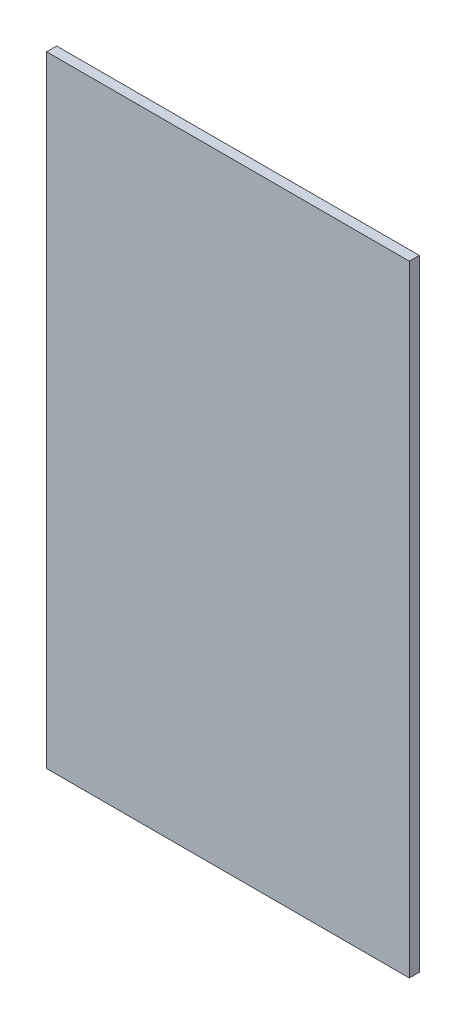
ISO-10303-21;
HEADER;
FILE_DESCRIPTION(('STEP AP214'),'2;1');
FILE_NAME('part.step','',(''),(''),'','','');
FILE_SCHEMA(('AUTOMOTIVE_DESIGN { 1 0 10303 214 1 1 1 1 }'));
ENDSEC;
DATA;
#1=APPLICATION_CONTEXT('core data for automotive mechanical design processes');
#2=APPLICATION_PROTOCOL_DEFINITION('international standard','automotive_design',2000,#1);
#3=PRODUCT_CONTEXT('',#1,'mechanical');
#4=PRODUCT('Part','Part','',(#3));
#5=PRODUCT_RELATED_PRODUCT_CATEGORY('part','',(#4));
#6=PRODUCT_DEFINITION_FORMATION('','',#4);
#7=PRODUCT_DEFINITION_CONTEXT('part definition',#1,'design');
#8=PRODUCT_DEFINITION('design','',#6,#7);
#9=PRODUCT_DEFINITION_SHAPE('','',#8);
#10=(LENGTH_UNIT() NAMED_UNIT(*) SI_UNIT(.MILLI.,.METRE.));
#11=(NAMED_UNIT(*) PLANE_ANGLE_UNIT() SI_UNIT($,.RADIAN.));
#12=(NAMED_UNIT(*) SI_UNIT($,.STERADIAN.) SOLID_ANGLE_UNIT());
#13=UNCERTAINTY_MEASURE_WITH_UNIT(LENGTH_MEASURE(1.E-05),#10,'distance_accuracy_value','');
#14=(GEOMETRIC_REPRESENTATION_CONTEXT(3) GLOBAL_UNCERTAINTY_ASSIGNED_CONTEXT((#13)) GLOBAL_UNIT_ASSIGNED_CONTEXT((#10,
#11,#12)) REPRESENTATION_CONTEXT('',''));
#15=CARTESIAN_POINT('',(0.,0.,0.));
#16=DIRECTION('',(0.,0.,1.));
#17=DIRECTION('',(1.,0.,0.));
#18=AXIS2_PLACEMENT_3D('',#15,#16,#17);
#19=CARTESIAN_POINT('',(0.,0.,12.7));
#20=DIRECTION('',(1.,0.,0.));
#21=DIRECTION('',(0.,0.,-1.));
#22=AXIS2_PLACEMENT_3D('',#19,#20,#21);
#23=PLANE('',#22);
#24=DIRECTION('',(0.,-1.,0.));
#25=VECTOR('',#24,1.);
#26=CARTESIAN_POINT('',(0.,0.,0.));
#27=LINE('',#26,#25);
#28=CARTESIAN_POINT('',(0.,787.4,0.));
#29=VERTEX_POINT('',#28);
#30=CARTESIAN_POINT('',(0.,0.,0.));
#31=VERTEX_POINT('',#30);
#32=EDGE_CURVE('E97',#29,#31,#27,.T.);
#33=ORIENTED_EDGE('',*,*,#32,.T.);
#34=DIRECTION('',(0.,0.,-1.));
#35=VECTOR('',#34,1.);
#36=CARTESIAN_POINT('',(0.,0.,12.7));
#37=LINE('',#36,#35);
#38=CARTESIAN_POINT('',(0.,0.,12.7));
#39=VERTEX_POINT('',#38);
#40=EDGE_CURVE('E11',#39,#31,#37,.T.);
#41=ORIENTED_EDGE('',*,*,#40,.F.);
#42=DIRECTION('',(0.,-1.,0.));
#43=VECTOR('',#42,1.);
#44=CARTESIAN_POINT('',(0.,0.,12.7));
#45=LINE('',#44,#43);
#46=CARTESIAN_POINT('',(0.,787.4,12.7));
#47=VERTEX_POINT('',#46);
#48=EDGE_CURVE('E85',#47,#39,#45,.T.);
#49=ORIENTED_EDGE('',*,*,#48,.F.);
#50=DIRECTION('',(0.,0.,-1.));
#51=VECTOR('',#50,1.);
#52=CARTESIAN_POINT('',(0.,787.4,12.7));
#53=LINE('',#52,#51);
#54=EDGE_CURVE('E93',#47,#29,#53,.T.);
#55=ORIENTED_EDGE('',*,*,#54,.T.);
#56=EDGE_LOOP('',(#33,#41,#49,#55));
#57=FACE_BOUND('',#56,.T.);
#58=ADVANCED_FACE('F34',(#57),#23,.F.);
#59=CARTESIAN_POINT('',(0.,0.,12.7));
#60=DIRECTION('',(0.,1.,0.));
#61=DIRECTION('',(0.,0.,1.));
#62=AXIS2_PLACEMENT_3D('',#59,#60,#61);
#63=PLANE('',#62);
#64=DIRECTION('',(1.,0.,0.));
#65=VECTOR('',#64,1.);
#66=CARTESIAN_POINT('',(0.,0.,0.));
#67=LINE('',#66,#65);
#68=CARTESIAN_POINT('',(460.12277982031,0.,0.));
#69=VERTEX_POINT('',#68);
#70=EDGE_CURVE('E89',#31,#69,#67,.T.);
#71=ORIENTED_EDGE('',*,*,#70,.T.);
#72=DIRECTION('',(0.,0.,-1.));
#73=VECTOR('',#72,1.);
#74=CARTESIAN_POINT('',(460.12277982031,0.,12.7));
#75=LINE('',#74,#73);
#76=CARTESIAN_POINT('',(460.12277982031,0.,12.7));
#77=VERTEX_POINT('',#76);
#78=EDGE_CURVE('E42',#77,#69,#75,.T.);
#79=ORIENTED_EDGE('',*,*,#78,.F.);
#80=DIRECTION('',(1.,0.,0.));
#81=VECTOR('',#80,1.);
#82=CARTESIAN_POINT('',(0.,0.,12.7));
#83=LINE('',#82,#81);
#84=EDGE_CURVE('E80',#39,#77,#83,.T.);
#85=ORIENTED_EDGE('',*,*,#84,.F.);
#86=ORIENTED_EDGE('',*,*,#40,.T.);
#87=EDGE_LOOP('',(#71,#79,#85,#86));
#88=FACE_BOUND('',#87,.T.);
#89=ADVANCED_FACE('F88',(#88),#63,.F.);
#90=CARTESIAN_POINT('',(460.12277982031,0.,12.7));
#91=DIRECTION('',(-1.,0.,0.));
#92=DIRECTION('',(0.,0.,1.));
#93=AXIS2_PLACEMENT_3D('',#90,#91,#92);
#94=PLANE('',#93);
#95=DIRECTION('',(0.,1.,0.));
#96=VECTOR('',#95,1.);
#97=CARTESIAN_POINT('',(460.12277982031,0.,0.));
#98=LINE('',#97,#96);
#99=CARTESIAN_POINT('',(460.12277982031,787.4,0.));
#100=VERTEX_POINT('',#99);
#101=EDGE_CURVE('E67',#69,#100,#98,.T.);
#102=ORIENTED_EDGE('',*,*,#101,.T.);
#103=DIRECTION('',(0.,0.,-1.));
#104=VECTOR('',#103,1.);
#105=CARTESIAN_POINT('',(460.12277982031,787.4,12.7));
#106=LINE('',#105,#104);
#107=CARTESIAN_POINT('',(460.12277982031,787.4,12.7));
#108=VERTEX_POINT('',#107);
#109=EDGE_CURVE('E90',#108,#100,#106,.T.);
#110=ORIENTED_EDGE('',*,*,#109,.F.);
#111=DIRECTION('',(0.,1.,0.));
#112=VECTOR('',#111,1.);
#113=CARTESIAN_POINT('',(460.12277982031,0.,12.7));
#114=LINE('',#113,#112);
#115=EDGE_CURVE('E83',#77,#108,#114,.T.);
#116=ORIENTED_EDGE('',*,*,#115,.F.);
#117=ORIENTED_EDGE('',*,*,#78,.T.);
#118=EDGE_LOOP('',(#102,#110,#116,#117));
#119=FACE_BOUND('',#118,.T.);
#120=ADVANCED_FACE('F91',(#119),#94,.F.);
#121=CARTESIAN_POINT('',(0.,787.4,12.7));
#122=DIRECTION('',(0.,-1.,0.));
#123=DIRECTION('',(0.,0.,-1.));
#124=AXIS2_PLACEMENT_3D('',#121,#122,#123);
#125=PLANE('',#124);
#126=DIRECTION('',(-1.,0.,0.));
#127=VECTOR('',#126,1.);
#128=CARTESIAN_POINT('',(0.,787.4,0.));
#129=LINE('',#128,#127);
#130=EDGE_CURVE('E73',#100,#29,#129,.T.);
#131=ORIENTED_EDGE('',*,*,#130,.T.);
#132=ORIENTED_EDGE('',*,*,#54,.F.);
#133=DIRECTION('',(-1.,0.,0.));
#134=VECTOR('',#133,1.);
#135=CARTESIAN_POINT('',(0.,787.4,12.7));
#136=LINE('',#135,#134);
#137=EDGE_CURVE('E50',#108,#47,#136,.T.);
#138=ORIENTED_EDGE('',*,*,#137,.F.);
#139=ORIENTED_EDGE('',*,*,#109,.T.);
#140=EDGE_LOOP('',(#131,#132,#138,#139));
#141=FACE_BOUND('',#140,.T.);
#142=ADVANCED_FACE('F104',(#141),#125,.F.);
#143=CARTESIAN_POINT('',(0.,0.,12.7));
#144=DIRECTION('',(0.,0.,-1.));
#145=DIRECTION('',(-1.,0.,0.));
#146=AXIS2_PLACEMENT_3D('',#143,#144,#145);
#147=PLANE('',#146);
#148=ORIENTED_EDGE('',*,*,#48,.T.);
#149=ORIENTED_EDGE('',*,*,#84,.T.);
#150=ORIENTED_EDGE('',*,*,#115,.T.);
#151=ORIENTED_EDGE('',*,*,#137,.T.);
#152=EDGE_LOOP('',(#148,#149,#150,#151));
#153=FACE_BOUND('',#152,.T.);
#154=ADVANCED_FACE('F81',(#153),#147,.F.);
#155=CARTESIAN_POINT('',(0.,0.,0.));
#156=DIRECTION('',(0.,0.,-1.));
#157=DIRECTION('',(-1.,0.,0.));
#158=AXIS2_PLACEMENT_3D('',#155,#156,#157);
#159=PLANE('',#158);
#160=ORIENTED_EDGE('',*,*,#32,.F.);
#161=ORIENTED_EDGE('',*,*,#130,.F.);
#162=ORIENTED_EDGE('',*,*,#101,.F.);
#163=ORIENTED_EDGE('',*,*,#70,.F.);
#164=EDGE_LOOP('',(#160,#161,#162,#163));
#165=FACE_BOUND('',#164,.T.);
#166=ADVANCED_FACE('F107',(#165),#159,.T.);
#167=CLOSED_SHELL('',(#58,#89,#120,#142,#154,#166));
#168=MANIFOLD_SOLID_BREP('B2',#167);
#169=ADVANCED_BREP_SHAPE_REPRESENTATION('',(#18,#168),#14);
#170=SHAPE_DEFINITION_REPRESENTATION(#9,#169);
ENDSEC;
END-ISO-10303-21;
